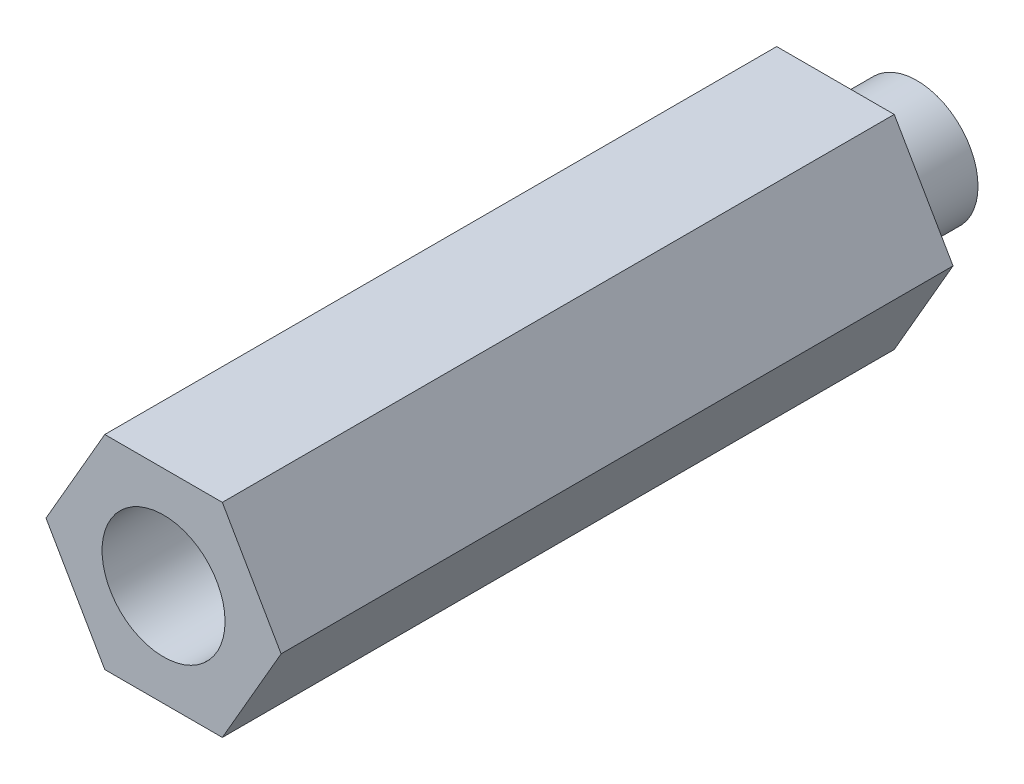
ISO-10303-21;
HEADER;
FILE_DESCRIPTION(('STEP AP214'),'2;1');
FILE_NAME('part.step','',(''),(''),'','','');
FILE_SCHEMA(('AUTOMOTIVE_DESIGN { 1 0 10303 214 1 1 1 1 }'));
ENDSEC;
DATA;
#1=APPLICATION_CONTEXT('core data for automotive mechanical design processes');
#2=APPLICATION_PROTOCOL_DEFINITION('international standard','automotive_design',2000,#1);
#3=PRODUCT_CONTEXT('',#1,'mechanical');
#4=PRODUCT('Part','Part','',(#3));
#5=PRODUCT_RELATED_PRODUCT_CATEGORY('part','',(#4));
#6=PRODUCT_DEFINITION_FORMATION('','',#4);
#7=PRODUCT_DEFINITION_CONTEXT('part definition',#1,'design');
#8=PRODUCT_DEFINITION('design','',#6,#7);
#9=PRODUCT_DEFINITION_SHAPE('','',#8);
#10=(LENGTH_UNIT() NAMED_UNIT(*) SI_UNIT(.MILLI.,.METRE.));
#11=(NAMED_UNIT(*) PLANE_ANGLE_UNIT() SI_UNIT($,.RADIAN.));
#12=(NAMED_UNIT(*) SI_UNIT($,.STERADIAN.) SOLID_ANGLE_UNIT());
#13=UNCERTAINTY_MEASURE_WITH_UNIT(LENGTH_MEASURE(1.E-05),#10,'distance_accuracy_value','');
#14=(GEOMETRIC_REPRESENTATION_CONTEXT(3) GLOBAL_UNCERTAINTY_ASSIGNED_CONTEXT((#13)) GLOBAL_UNIT_ASSIGNED_CONTEXT((#10,
#11,#12)) REPRESENTATION_CONTEXT('',''));
#15=CARTESIAN_POINT('',(0.,0.,0.));
#16=DIRECTION('',(0.,0.,1.));
#17=DIRECTION('',(1.,0.,0.));
#18=AXIS2_PLACEMENT_3D('',#15,#16,#17);
#19=CARTESIAN_POINT('',(0.,0.,16.5));
#20=DIRECTION('',(0.,0.,1.));
#21=DIRECTION('',(1.,0.,0.));
#22=AXIS2_PLACEMENT_3D('',#19,#20,#21);
#23=PLANE('',#22);
#24=DIRECTION('',(0.5,0.866025403784439,0.));
#25=VECTOR('',#24,1.);
#26=CARTESIAN_POINT('',(1.44337567297406,-2.5,16.5));
#27=LINE('',#26,#25);
#28=CARTESIAN_POINT('',(1.44337567297406,-2.5,16.5));
#29=VERTEX_POINT('',#28);
#30=CARTESIAN_POINT('',(2.88675134594813,0.,16.5));
#31=VERTEX_POINT('',#30);
#32=EDGE_CURVE('E145',#29,#31,#27,.T.);
#33=ORIENTED_EDGE('',*,*,#32,.T.);
#34=DIRECTION('',(-0.5,0.866025403784439,0.));
#35=VECTOR('',#34,1.);
#36=CARTESIAN_POINT('',(2.88675134594813,0.,16.5));
#37=LINE('',#36,#35);
#38=CARTESIAN_POINT('',(1.44337567297406,2.5,16.5));
#39=VERTEX_POINT('',#38);
#40=EDGE_CURVE('E105',#31,#39,#37,.T.);
#41=ORIENTED_EDGE('',*,*,#40,.T.);
#42=DIRECTION('',(-1.,0.,0.));
#43=VECTOR('',#42,1.);
#44=CARTESIAN_POINT('',(1.44337567297406,2.5,16.5));
#45=LINE('',#44,#43);
#46=CARTESIAN_POINT('',(-1.44337567297406,2.5,16.5));
#47=VERTEX_POINT('',#46);
#48=EDGE_CURVE('E113',#39,#47,#45,.T.);
#49=ORIENTED_EDGE('',*,*,#48,.T.);
#50=DIRECTION('',(-0.5,-0.866025403784439,0.));
#51=VECTOR('',#50,1.);
#52=CARTESIAN_POINT('',(-1.44337567297406,2.5,16.5));
#53=LINE('',#52,#51);
#54=CARTESIAN_POINT('',(-2.88675134594813,0.,16.5));
#55=VERTEX_POINT('',#54);
#56=EDGE_CURVE('E108',#47,#55,#53,.T.);
#57=ORIENTED_EDGE('',*,*,#56,.T.);
#58=DIRECTION('',(0.5,-0.866025403784439,0.));
#59=VECTOR('',#58,1.);
#60=CARTESIAN_POINT('',(-2.88675134594813,0.,16.5));
#61=LINE('',#60,#59);
#62=CARTESIAN_POINT('',(-1.44337567297407,-2.5,16.5));
#63=VERTEX_POINT('',#62);
#64=EDGE_CURVE('E114',#55,#63,#61,.T.);
#65=ORIENTED_EDGE('',*,*,#64,.T.);
#66=DIRECTION('',(1.,0.,0.));
#67=VECTOR('',#66,1.);
#68=CARTESIAN_POINT('',(-1.44337567297407,-2.5,16.5));
#69=LINE('',#68,#67);
#70=EDGE_CURVE('E64',#63,#29,#69,.T.);
#71=ORIENTED_EDGE('',*,*,#70,.T.);
#72=EDGE_LOOP('',(#33,#41,#49,#57,#65,#71));
#73=FACE_BOUND('',#72,.T.);
#74=CARTESIAN_POINT('',(0.,0.,16.5));
#75=DIRECTION('',(0.,0.,1.));
#76=DIRECTION('',(1.,0.,0.));
#77=AXIS2_PLACEMENT_3D('',#74,#75,#76);
#78=CIRCLE('',#77,1.51);
#79=CARTESIAN_POINT('',(1.51,0.,16.5));
#80=VERTEX_POINT('',#79);
#81=EDGE_CURVE('E139',#80,#80,#78,.T.);
#82=ORIENTED_EDGE('',*,*,#81,.F.);
#83=EDGE_LOOP('',(#82));
#84=FACE_BOUND('',#83,.T.);
#85=ADVANCED_FACE('F50',(#73,#84),#23,.T.);
#86=CARTESIAN_POINT('',(0.,0.,0.));
#87=DIRECTION('',(0.,0.,1.));
#88=DIRECTION('',(1.,0.,0.));
#89=AXIS2_PLACEMENT_3D('',#86,#87,#88);
#90=PLANE('',#89);
#91=CARTESIAN_POINT('',(0.,0.,0.));
#92=DIRECTION('',(0.,0.,1.));
#93=DIRECTION('',(1.,0.,0.));
#94=AXIS2_PLACEMENT_3D('',#91,#92,#93);
#95=CIRCLE('',#94,1.5);
#96=CARTESIAN_POINT('',(1.5,0.,0.));
#97=VERTEX_POINT('',#96);
#98=EDGE_CURVE('E164',#97,#97,#95,.T.);
#99=ORIENTED_EDGE('',*,*,#98,.T.);
#100=EDGE_LOOP('',(#99));
#101=FACE_BOUND('',#100,.T.);
#102=DIRECTION('',(0.5,0.866025403784439,0.));
#103=VECTOR('',#102,1.);
#104=CARTESIAN_POINT('',(1.44337567297406,-2.5,0.));
#105=LINE('',#104,#103);
#106=CARTESIAN_POINT('',(1.44337567297406,-2.5,0.));
#107=VERTEX_POINT('',#106);
#108=CARTESIAN_POINT('',(2.88675134594813,0.,0.));
#109=VERTEX_POINT('',#108);
#110=EDGE_CURVE('E131',#107,#109,#105,.T.);
#111=ORIENTED_EDGE('',*,*,#110,.F.);
#112=DIRECTION('',(1.,0.,0.));
#113=VECTOR('',#112,1.);
#114=CARTESIAN_POINT('',(-1.44337567297407,-2.5,0.));
#115=LINE('',#114,#113);
#116=CARTESIAN_POINT('',(-1.44337567297407,-2.5,0.));
#117=VERTEX_POINT('',#116);
#118=EDGE_CURVE('E91',#117,#107,#115,.T.);
#119=ORIENTED_EDGE('',*,*,#118,.F.);
#120=DIRECTION('',(0.5,-0.866025403784439,0.));
#121=VECTOR('',#120,1.);
#122=CARTESIAN_POINT('',(-2.88675134594813,0.,0.));
#123=LINE('',#122,#121);
#124=CARTESIAN_POINT('',(-2.88675134594813,0.,0.));
#125=VERTEX_POINT('',#124);
#126=EDGE_CURVE('E87',#125,#117,#123,.T.);
#127=ORIENTED_EDGE('',*,*,#126,.F.);
#128=DIRECTION('',(-0.5,-0.866025403784439,0.));
#129=VECTOR('',#128,1.);
#130=CARTESIAN_POINT('',(-1.44337567297406,2.5,0.));
#131=LINE('',#130,#129);
#132=CARTESIAN_POINT('',(-1.44337567297406,2.5,0.));
#133=VERTEX_POINT('',#132);
#134=EDGE_CURVE('E125',#133,#125,#131,.T.);
#135=ORIENTED_EDGE('',*,*,#134,.F.);
#136=DIRECTION('',(-1.,0.,0.));
#137=VECTOR('',#136,1.);
#138=CARTESIAN_POINT('',(1.44337567297406,2.5,0.));
#139=LINE('',#138,#137);
#140=CARTESIAN_POINT('',(1.44337567297406,2.5,0.));
#141=VERTEX_POINT('',#140);
#142=EDGE_CURVE('E136',#141,#133,#139,.T.);
#143=ORIENTED_EDGE('',*,*,#142,.F.);
#144=DIRECTION('',(-0.5,0.866025403784439,0.));
#145=VECTOR('',#144,1.);
#146=CARTESIAN_POINT('',(2.88675134594813,0.,0.));
#147=LINE('',#146,#145);
#148=EDGE_CURVE('E137',#109,#141,#147,.T.);
#149=ORIENTED_EDGE('',*,*,#148,.F.);
#150=EDGE_LOOP('',(#111,#119,#127,#135,#143,#149));
#151=FACE_BOUND('',#150,.T.);
#152=ADVANCED_FACE('F156',(#101,#151),#90,.F.);
#153=CARTESIAN_POINT('',(1.44337567297406,-2.5,16.5));
#154=DIRECTION('',(-0.866025403784439,0.5,0.));
#155=DIRECTION('',(-0.5,-0.866025403784439,0.));
#156=AXIS2_PLACEMENT_3D('',#153,#154,#155);
#157=PLANE('',#156);
#158=ORIENTED_EDGE('',*,*,#110,.T.);
#159=DIRECTION('',(0.,0.,-1.));
#160=VECTOR('',#159,1.);
#161=CARTESIAN_POINT('',(2.88675134594813,0.,16.5));
#162=LINE('',#161,#160);
#163=EDGE_CURVE('E57',#31,#109,#162,.T.);
#164=ORIENTED_EDGE('',*,*,#163,.F.);
#165=ORIENTED_EDGE('',*,*,#32,.F.);
#166=DIRECTION('',(0.,0.,-1.));
#167=VECTOR('',#166,1.);
#168=CARTESIAN_POINT('',(1.44337567297406,-2.5,16.5));
#169=LINE('',#168,#167);
#170=EDGE_CURVE('E129',#29,#107,#169,.T.);
#171=ORIENTED_EDGE('',*,*,#170,.T.);
#172=EDGE_LOOP('',(#158,#164,#165,#171));
#173=FACE_BOUND('',#172,.T.);
#174=ADVANCED_FACE('F47',(#173),#157,.F.);
#175=CARTESIAN_POINT('',(2.88675134594813,0.,16.5));
#176=DIRECTION('',(-0.866025403784439,-0.5,0.));
#177=DIRECTION('',(0.5,-0.866025403784439,0.));
#178=AXIS2_PLACEMENT_3D('',#175,#176,#177);
#179=PLANE('',#178);
#180=ORIENTED_EDGE('',*,*,#148,.T.);
#181=DIRECTION('',(0.,0.,-1.));
#182=VECTOR('',#181,1.);
#183=CARTESIAN_POINT('',(1.44337567297406,2.5,16.5));
#184=LINE('',#183,#182);
#185=EDGE_CURVE('E146',#39,#141,#184,.T.);
#186=ORIENTED_EDGE('',*,*,#185,.F.);
#187=ORIENTED_EDGE('',*,*,#40,.F.);
#188=ORIENTED_EDGE('',*,*,#163,.T.);
#189=EDGE_LOOP('',(#180,#186,#187,#188));
#190=FACE_BOUND('',#189,.T.);
#191=ADVANCED_FACE('F151',(#190),#179,.F.);
#192=CARTESIAN_POINT('',(1.44337567297406,2.5,16.5));
#193=DIRECTION('',(0.,-1.,0.));
#194=DIRECTION('',(1.,0.,0.));
#195=AXIS2_PLACEMENT_3D('',#192,#193,#194);
#196=PLANE('',#195);
#197=ORIENTED_EDGE('',*,*,#142,.T.);
#198=DIRECTION('',(0.,0.,-1.));
#199=VECTOR('',#198,1.);
#200=CARTESIAN_POINT('',(-1.44337567297406,2.5,16.5));
#201=LINE('',#200,#199);
#202=EDGE_CURVE('E121',#47,#133,#201,.T.);
#203=ORIENTED_EDGE('',*,*,#202,.F.);
#204=ORIENTED_EDGE('',*,*,#48,.F.);
#205=ORIENTED_EDGE('',*,*,#185,.T.);
#206=EDGE_LOOP('',(#197,#203,#204,#205));
#207=FACE_BOUND('',#206,.T.);
#208=ADVANCED_FACE('F157',(#207),#196,.F.);
#209=CARTESIAN_POINT('',(-1.44337567297406,2.5,16.5));
#210=DIRECTION('',(0.866025403784439,-0.5,0.));
#211=DIRECTION('',(0.5,0.866025403784439,0.));
#212=AXIS2_PLACEMENT_3D('',#209,#210,#211);
#213=PLANE('',#212);
#214=ORIENTED_EDGE('',*,*,#134,.T.);
#215=DIRECTION('',(0.,0.,-1.));
#216=VECTOR('',#215,1.);
#217=CARTESIAN_POINT('',(-2.88675134594813,0.,16.5));
#218=LINE('',#217,#216);
#219=EDGE_CURVE('E117',#55,#125,#218,.T.);
#220=ORIENTED_EDGE('',*,*,#219,.F.);
#221=ORIENTED_EDGE('',*,*,#56,.F.);
#222=ORIENTED_EDGE('',*,*,#202,.T.);
#223=EDGE_LOOP('',(#214,#220,#221,#222));
#224=FACE_BOUND('',#223,.T.);
#225=ADVANCED_FACE('F122',(#224),#213,.F.);
#226=CARTESIAN_POINT('',(-2.88675134594813,0.,16.5));
#227=DIRECTION('',(0.866025403784439,0.5,0.));
#228=DIRECTION('',(-0.5,0.866025403784439,0.));
#229=AXIS2_PLACEMENT_3D('',#226,#227,#228);
#230=PLANE('',#229);
#231=ORIENTED_EDGE('',*,*,#126,.T.);
#232=DIRECTION('',(0.,0.,-1.));
#233=VECTOR('',#232,1.);
#234=CARTESIAN_POINT('',(-1.44337567297407,-2.5,16.5));
#235=LINE('',#234,#233);
#236=EDGE_CURVE('E123',#63,#117,#235,.T.);
#237=ORIENTED_EDGE('',*,*,#236,.F.);
#238=ORIENTED_EDGE('',*,*,#64,.F.);
#239=ORIENTED_EDGE('',*,*,#219,.T.);
#240=EDGE_LOOP('',(#231,#237,#238,#239));
#241=FACE_BOUND('',#240,.T.);
#242=ADVANCED_FACE('F130',(#241),#230,.F.);
#243=CARTESIAN_POINT('',(-1.44337567297407,-2.5,16.5));
#244=DIRECTION('',(0.,1.,0.));
#245=DIRECTION('',(-1.,0.,0.));
#246=AXIS2_PLACEMENT_3D('',#243,#244,#245);
#247=PLANE('',#246);
#248=ORIENTED_EDGE('',*,*,#118,.T.);
#249=ORIENTED_EDGE('',*,*,#170,.F.);
#250=ORIENTED_EDGE('',*,*,#70,.F.);
#251=ORIENTED_EDGE('',*,*,#236,.T.);
#252=EDGE_LOOP('',(#248,#249,#250,#251));
#253=FACE_BOUND('',#252,.T.);
#254=ADVANCED_FACE('F193',(#253),#247,.F.);
#255=CARTESIAN_POINT('',(0.,0.,16.5));
#256=DIRECTION('',(0.,0.,-1.));
#257=DIRECTION('',(-1.,0.,0.));
#258=AXIS2_PLACEMENT_3D('',#255,#256,#257);
#259=CYLINDRICAL_SURFACE('',#258,1.51);
#260=CARTESIAN_POINT('',(0.,0.,0.449999999999999));
#261=DIRECTION('',(0.,0.,1.));
#262=DIRECTION('',(1.,0.,0.));
#263=AXIS2_PLACEMENT_3D('',#260,#261,#262);
#264=CIRCLE('',#263,1.51);
#265=CARTESIAN_POINT('',(1.51,0.,0.449999999999999));
#266=VERTEX_POINT('',#265);
#267=EDGE_CURVE('E11',#266,#266,#264,.T.);
#268=ORIENTED_EDGE('',*,*,#267,.F.);
#269=EDGE_LOOP('',(#268));
#270=FACE_BOUND('',#269,.T.);
#271=ORIENTED_EDGE('',*,*,#81,.T.);
#272=EDGE_LOOP('',(#271));
#273=FACE_BOUND('',#272,.T.);
#274=ADVANCED_FACE('F194',(#270,#273),#259,.F.);
#275=CARTESIAN_POINT('',(0.,0.,0.45));
#276=DIRECTION('',(0.,0.,1.));
#277=DIRECTION('',(1.,0.,0.));
#278=AXIS2_PLACEMENT_3D('',#275,#276,#277);
#279=PLANE('',#278);
#280=ORIENTED_EDGE('',*,*,#267,.T.);
#281=EDGE_LOOP('',(#280));
#282=FACE_BOUND('',#281,.T.);
#283=ADVANCED_FACE('F179',(#282),#279,.T.);
#284=CARTESIAN_POINT('',(0.,0.,0.));
#285=DIRECTION('',(0.,0.,-1.));
#286=DIRECTION('',(-1.,0.,0.));
#287=AXIS2_PLACEMENT_3D('',#284,#285,#286);
#288=CYLINDRICAL_SURFACE('',#287,1.5);
#289=ORIENTED_EDGE('',*,*,#98,.F.);
#290=EDGE_LOOP('',(#289));
#291=FACE_BOUND('',#290,.T.);
#292=CARTESIAN_POINT('',(0.,0.,-2.));
#293=DIRECTION('',(0.,0.,1.));
#294=DIRECTION('',(1.,0.,0.));
#295=AXIS2_PLACEMENT_3D('',#292,#293,#294);
#296=CIRCLE('',#295,1.5);
#297=CARTESIAN_POINT('',(1.5,0.,-2.));
#298=VERTEX_POINT('',#297);
#299=EDGE_CURVE('E167',#298,#298,#296,.T.);
#300=ORIENTED_EDGE('',*,*,#299,.T.);
#301=EDGE_LOOP('',(#300));
#302=FACE_BOUND('',#301,.T.);
#303=ADVANCED_FACE('F171',(#291,#302),#288,.T.);
#304=CARTESIAN_POINT('',(0.,0.,-2.));
#305=DIRECTION('',(0.,0.,1.));
#306=DIRECTION('',(1.,0.,0.));
#307=AXIS2_PLACEMENT_3D('',#304,#305,#306);
#308=PLANE('',#307);
#309=ORIENTED_EDGE('',*,*,#299,.F.);
#310=EDGE_LOOP('',(#309));
#311=FACE_BOUND('',#310,.T.);
#312=ADVANCED_FACE('F177',(#311),#308,.F.);
#313=CLOSED_SHELL('',(#85,#152,#174,#191,#208,#225,#242,#254,#274,#283,#303,#312));
#314=MANIFOLD_SOLID_BREP('B2',#313);
#315=ADVANCED_BREP_SHAPE_REPRESENTATION('',(#18,#314),#14);
#316=SHAPE_DEFINITION_REPRESENTATION(#9,#315);
ENDSEC;
END-ISO-10303-21;
